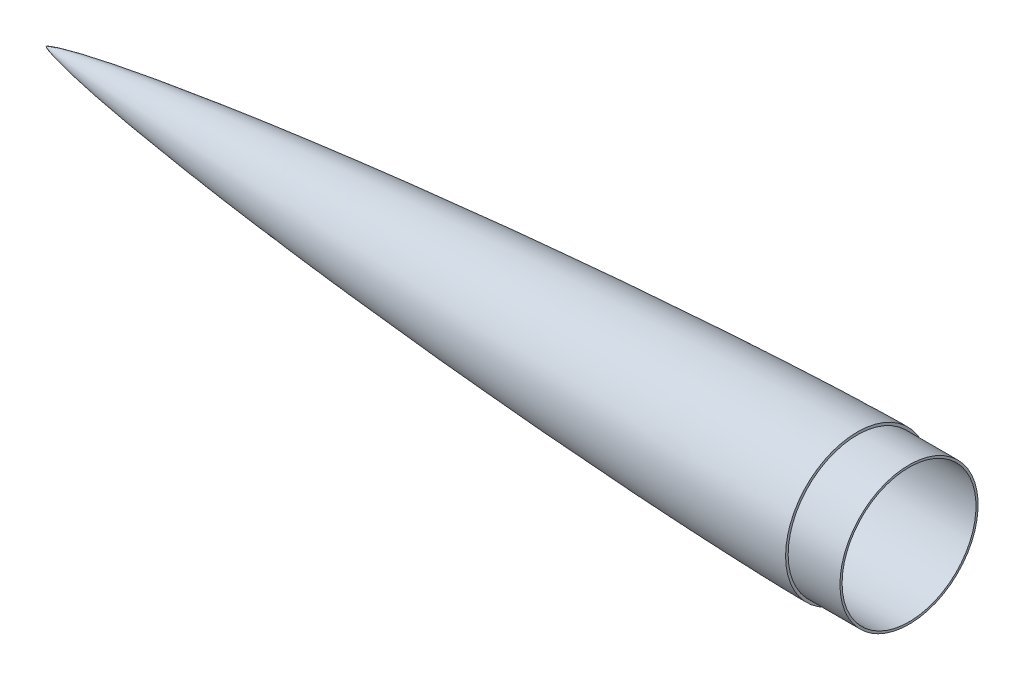
ISO-10303-21;
HEADER;
FILE_DESCRIPTION(('STEP AP214'),'2;1');
FILE_NAME('part.step','',(''),(''),'','','');
FILE_SCHEMA(('AUTOMOTIVE_DESIGN { 1 0 10303 214 1 1 1 1 }'));
ENDSEC;
DATA;
#1=APPLICATION_CONTEXT('core data for automotive mechanical design processes');
#2=APPLICATION_PROTOCOL_DEFINITION('international standard','automotive_design',2000,#1);
#3=PRODUCT_CONTEXT('',#1,'mechanical');
#4=PRODUCT('Part','Part','',(#3));
#5=PRODUCT_RELATED_PRODUCT_CATEGORY('part','',(#4));
#6=PRODUCT_DEFINITION_FORMATION('','',#4);
#7=PRODUCT_DEFINITION_CONTEXT('part definition',#1,'design');
#8=PRODUCT_DEFINITION('design','',#6,#7);
#9=PRODUCT_DEFINITION_SHAPE('','',#8);
#10=(LENGTH_UNIT() NAMED_UNIT(*) SI_UNIT(.MILLI.,.METRE.));
#11=(NAMED_UNIT(*) PLANE_ANGLE_UNIT() SI_UNIT($,.RADIAN.));
#12=(NAMED_UNIT(*) SI_UNIT($,.STERADIAN.) SOLID_ANGLE_UNIT());
#13=UNCERTAINTY_MEASURE_WITH_UNIT(LENGTH_MEASURE(1.E-05),#10,'distance_accuracy_value','');
#14=(GEOMETRIC_REPRESENTATION_CONTEXT(3) GLOBAL_UNCERTAINTY_ASSIGNED_CONTEXT((#13)) GLOBAL_UNIT_ASSIGNED_CONTEXT((#10,
#11,#12)) REPRESENTATION_CONTEXT('',''));
#15=CARTESIAN_POINT('',(0.,0.,0.));
#16=DIRECTION('',(0.,0.,1.));
#17=DIRECTION('',(1.,0.,0.));
#18=AXIS2_PLACEMENT_3D('',#15,#16,#17);
#19=CARTESIAN_POINT('',(596.9,52.74818,0.));
#20=CARTESIAN_POINT('',(594.981085772942,52.7439766182815,0.));
#21=CARTESIAN_POINT('',(591.143361642924,52.7119561177822,0.));
#22=CARTESIAN_POINT('',(583.468325071776,52.6115940478195,0.));
#23=CARTESIAN_POINT('',(571.206307330957,52.3702922496184,0.));
#24=CARTESIAN_POINT('',(556.277134536275,51.9856247831863,0.));
#25=CARTESIAN_POINT('',(534.095751609961,51.2822622218943,0.));
#26=CARTESIAN_POINT('',(506.5841207546,50.2205319325961,0.));
#27=CARTESIAN_POINT('',(474.496680759096,48.7563639094325,0.));
#28=CARTESIAN_POINT('',(437.838411885817,46.818732197122,0.));
#29=CARTESIAN_POINT('',(401.193599470544,44.6420572267023,0.));
#30=CARTESIAN_POINT('',(364.562894607915,42.2399567576188,0.));
#31=CARTESIAN_POINT('',(327.947239610889,39.618425854242,0.));
#32=CARTESIAN_POINT('',(291.348007401785,36.7768124514222,0.));
#33=CARTESIAN_POINT('',(254.767048184149,33.7085063186159,0.));
#34=CARTESIAN_POINT('',(218.207080059752,30.3992455850085,0.));
#35=CARTESIAN_POINT('',(181.67186265107,26.8260098654848,0.));
#36=CARTESIAN_POINT('',(145.167419267207,22.9502479118758,0.));
#37=CARTESIAN_POINT('',(108.703042074813,18.711081158448,0.));
#38=CARTESIAN_POINT('',(75.561592020845,14.4184193653755,0.));
#39=CARTESIAN_POINT('',(48.0380921073077,10.3790406790519,0.));
#40=CARTESIAN_POINT('',(27.782103231772,6.92717758336565,0.));
#41=CARTESIAN_POINT('',(15.6155281201881,4.51233854333897,0.));
#42=CARTESIAN_POINT('',(8.71933118048638,2.91617819387342,0.));
#43=CARTESIAN_POINT('',(5.02966537861984,1.92884340558088,0.));
#44=CARTESIAN_POINT('',(3.02858814726836,1.31676153051974,0.));
#45=CARTESIAN_POINT('',(1.91317692998907,0.93176035109636,0.));
#46=CARTESIAN_POINT('',(1.29300271208459,0.693253150144167,0.));
#47=CARTESIAN_POINT('',(0.932165851339865,0.541497874129996,0.));
#48=CARTESIAN_POINT('',(0.699728382330023,0.436250009913596,0.));
#49=CARTESIAN_POINT('',(0.539072772842008,0.359186242832004,0.));
#50=CARTESIAN_POINT('',(0.399119277455206,0.287038857933432,0.));
#51=CARTESIAN_POINT('',(0.279818282563663,0.220197585336474,0.));
#52=CARTESIAN_POINT('',(0.180428525159842,0.158737146182066,0.));
#53=CARTESIAN_POINT('',(0.110473241421188,0.110595859922417,0.));
#54=CARTESIAN_POINT('',(0.0582878402621543,0.0690247542532056,0.));
#55=CARTESIAN_POINT('',(0.023331290383149,0.0352525733814115,0.));
#56=CARTESIAN_POINT('',(0.00804574966633972,0.0163261743468633,0.));
#57=CARTESIAN_POINT('',(0.00237693213132801,0.00563433549737124,0.));
#58=CARTESIAN_POINT('',(0.,0.,0.));
#59=B_SPLINE_CURVE_WITH_KNOTS('',4,(#19,#20,#21,#22,#23,#24,#25,#26,#27,#28,#29,#30,#31,#32,#33,
#34,#35,#36,#37,#38,#39,#40,#41,#42,#43,#44,#45,#46,#47,#48,#49,#50,#51,#52,#53,#54,#55,#56,#57,
#58),.UNSPECIFIED.,.F.,.F.,(5,1,1,1,1,1,1,1,1,1,1,1,1,1,1,1,1,1,1,1,1,1,1,1,1,1,1,1,1,1,1,1,1,1,
1,1,5),(0.,0.0127915006460431,0.0255830012920861,0.0511660025841724,0.0817539552175705,
0.112341907850969,0.173517813554601,0.234693719179658,0.295869624144422,0.357045529383124,
0.418221434840136,0.479397340471153,0.54057324623338,0.601749151591606,0.662925056674679,
0.724100961894715,0.785276867533579,0.846452772012617,0.907628670550915,0.946859777235718,
0.970700652554181,0.983412262477229,0.990301731317356,0.994037247427691,0.996156512029755,
0.997358787258242,0.99816596334814,0.998465742833605,0.99876552231907,0.99905955597412,
0.99935358962917,0.999515192221878,0.999676794814585,0.999838397407293,0.999919198703646,
0.999959599351823,1.),.UNSPECIFIED.);
#60=CARTESIAN_POINT('',(0.,0.,0.));
#61=DIRECTION('',(-1.,0.,0.));
#62=AXIS1_PLACEMENT('',#60,#61);
#63=SURFACE_OF_REVOLUTION('',#59,#62);
#64=CARTESIAN_POINT('',(0.,0.,0.));
#65=VERTEX_POINT('',#64);
#66=VERTEX_LOOP('',#65);
#67=FACE_BOUND('',#66,.T.);
#68=CARTESIAN_POINT('',(596.9,0.,0.));
#69=DIRECTION('',(-1.,0.,0.));
#70=DIRECTION('',(0.,0.,1.));
#71=AXIS2_PLACEMENT_3D('',#68,#69,#70);
#72=CIRCLE('',#71,52.74818);
#73=CARTESIAN_POINT('',(596.9,0.,52.74818));
#74=VERTEX_POINT('',#73);
#75=EDGE_CURVE('E11',#74,#74,#72,.T.);
#76=ORIENTED_EDGE('',*,*,#75,.T.);
#77=EDGE_LOOP('',(#76));
#78=FACE_BOUND('',#77,.T.);
#79=ADVANCED_FACE('F42',(#67,#78),#63,.T.);
#80=CARTESIAN_POINT('',(596.9,0.,0.));
#81=DIRECTION('',(-1.,0.,0.));
#82=DIRECTION('',(0.,0.,1.));
#83=AXIS2_PLACEMENT_3D('',#80,#81,#82);
#84=PLANE('',#83);
#85=CARTESIAN_POINT('',(596.9,0.,0.));
#86=DIRECTION('',(-1.,0.,0.));
#87=DIRECTION('',(0.,0.,1.));
#88=AXIS2_PLACEMENT_3D('',#85,#86,#87);
#89=CIRCLE('',#88,50.8380953963041);
#90=CARTESIAN_POINT('',(596.9,0.,50.8380953963041));
#91=VERTEX_POINT('',#90);
#92=EDGE_CURVE('E51',#91,#91,#89,.F.);
#93=ORIENTED_EDGE('',*,*,#92,.F.);
#94=EDGE_LOOP('',(#93));
#95=FACE_BOUND('',#94,.T.);
#96=ORIENTED_EDGE('',*,*,#75,.F.);
#97=EDGE_LOOP('',(#96));
#98=FACE_BOUND('',#97,.T.);
#99=ADVANCED_FACE('F90',(#95,#98),#84,.F.);
#100=CARTESIAN_POINT('',(635.,0.,0.));
#101=DIRECTION('',(-1.,0.,0.));
#102=DIRECTION('',(0.,0.,1.));
#103=AXIS2_PLACEMENT_3D('',#100,#101,#102);
#104=CYLINDRICAL_SURFACE('',#103,50.8380953963041);
#105=CARTESIAN_POINT('',(635.,0.,0.));
#106=DIRECTION('',(1.,0.,0.));
#107=DIRECTION('',(0.,0.,-1.));
#108=AXIS2_PLACEMENT_3D('',#105,#106,#107);
#109=CIRCLE('',#108,50.8380953963041);
#110=CARTESIAN_POINT('',(635.,0.,50.8380953963041));
#111=VERTEX_POINT('',#110);
#112=EDGE_CURVE('E65',#111,#111,#109,.T.);
#113=CARTESIAN_POINT('',(635.,0.,50.8380953963041));
#114=CARTESIAN_POINT('',(634.603125,0.,50.8380953963041));
#115=CARTESIAN_POINT('',(634.20625,0.,50.8380953963041));
#116=CARTESIAN_POINT('',(633.4125,0.,50.8380953963041));
#117=CARTESIAN_POINT('',(633.015625,0.,50.8380953963041));
#118=CARTESIAN_POINT('',(632.221875,0.,50.8380953963041));
#119=CARTESIAN_POINT('',(631.825,0.,50.8380953963041));
#120=CARTESIAN_POINT('',(631.03125,0.,50.8380953963041));
#121=CARTESIAN_POINT('',(630.634375,0.,50.8380953963041));
#122=CARTESIAN_POINT('',(629.840625,0.,50.8380953963041));
#123=CARTESIAN_POINT('',(629.44375,0.,50.8380953963041));
#124=CARTESIAN_POINT('',(628.65,0.,50.8380953963041));
#125=CARTESIAN_POINT('',(628.253125,0.,50.8380953963041));
#126=CARTESIAN_POINT('',(627.459375,0.,50.8380953963041));
#127=CARTESIAN_POINT('',(627.0625,0.,50.8380953963041));
#128=CARTESIAN_POINT('',(626.26875,0.,50.8380953963041));
#129=CARTESIAN_POINT('',(625.871875,0.,50.8380953963041));
#130=CARTESIAN_POINT('',(625.078125,0.,50.8380953963041));
#131=CARTESIAN_POINT('',(624.68125,0.,50.8380953963041));
#132=CARTESIAN_POINT('',(623.8875,0.,50.8380953963041));
#133=CARTESIAN_POINT('',(623.490625,0.,50.8380953963041));
#134=CARTESIAN_POINT('',(622.696875,0.,50.8380953963041));
#135=CARTESIAN_POINT('',(622.3,0.,50.8380953963041));
#136=CARTESIAN_POINT('',(621.50625,0.,50.8380953963041));
#137=CARTESIAN_POINT('',(621.109375,0.,50.8380953963041));
#138=CARTESIAN_POINT('',(620.315625,0.,50.8380953963041));
#139=CARTESIAN_POINT('',(619.91875,0.,50.8380953963041));
#140=CARTESIAN_POINT('',(619.125,0.,50.8380953963041));
#141=CARTESIAN_POINT('',(618.728125,0.,50.8380953963041));
#142=CARTESIAN_POINT('',(617.934375,0.,50.8380953963041));
#143=CARTESIAN_POINT('',(617.5375,0.,50.8380953963041));
#144=CARTESIAN_POINT('',(616.74375,0.,50.8380953963041));
#145=CARTESIAN_POINT('',(616.346875,0.,50.8380953963041));
#146=CARTESIAN_POINT('',(615.553125,0.,50.8380953963041));
#147=CARTESIAN_POINT('',(615.15625,0.,50.8380953963041));
#148=CARTESIAN_POINT('',(614.3625,0.,50.8380953963041));
#149=CARTESIAN_POINT('',(613.965625,0.,50.8380953963041));
#150=CARTESIAN_POINT('',(613.171875,0.,50.8380953963041));
#151=CARTESIAN_POINT('',(612.775,0.,50.8380953963041));
#152=CARTESIAN_POINT('',(611.98125,0.,50.8380953963041));
#153=CARTESIAN_POINT('',(611.584375,0.,50.8380953963041));
#154=CARTESIAN_POINT('',(610.790625,0.,50.8380953963041));
#155=CARTESIAN_POINT('',(610.39375,0.,50.8380953963041));
#156=CARTESIAN_POINT('',(609.6,0.,50.8380953963041));
#157=CARTESIAN_POINT('',(609.203125,0.,50.8380953963041));
#158=CARTESIAN_POINT('',(608.409375,0.,50.8380953963041));
#159=CARTESIAN_POINT('',(608.0125,0.,50.8380953963041));
#160=CARTESIAN_POINT('',(607.21875,0.,50.8380953963041));
#161=CARTESIAN_POINT('',(606.821875,0.,50.8380953963041));
#162=CARTESIAN_POINT('',(606.028125,0.,50.8380953963041));
#163=CARTESIAN_POINT('',(605.63125,0.,50.8380953963041));
#164=CARTESIAN_POINT('',(604.8375,0.,50.8380953963041));
#165=CARTESIAN_POINT('',(604.440625,0.,50.8380953963041));
#166=CARTESIAN_POINT('',(603.646875,0.,50.8380953963041));
#167=CARTESIAN_POINT('',(603.25,0.,50.8380953963041));
#168=CARTESIAN_POINT('',(602.45625,0.,50.8380953963041));
#169=CARTESIAN_POINT('',(602.059375,0.,50.8380953963041));
#170=CARTESIAN_POINT('',(601.265625,0.,50.8380953963041));
#171=CARTESIAN_POINT('',(600.86875,0.,50.8380953963041));
#172=CARTESIAN_POINT('',(600.075,0.,50.8380953963041));
#173=CARTESIAN_POINT('',(599.678125,0.,50.8380953963041));
#174=CARTESIAN_POINT('',(598.884375,0.,50.8380953963041));
#175=CARTESIAN_POINT('',(598.4875,0.,50.8380953963041));
#176=CARTESIAN_POINT('',(597.69375,0.,50.8380953963041));
#177=CARTESIAN_POINT('',(597.296875,0.,50.8380953963041));
#178=CARTESIAN_POINT('',(596.9,0.,50.8380953963041));
#179=B_SPLINE_CURVE_WITH_KNOTS('',3,(#113,#114,#115,#116,#117,#118,#119,#120,#121,#122,#123,
#124,#125,#126,#127,#128,#129,#130,#131,#132,#133,#134,#135,#136,#137,#138,#139,#140,#141,#142,
#143,#144,#145,#146,#147,#148,#149,#150,#151,#152,#153,#154,#155,#156,#157,#158,#159,#160,#161,
#162,#163,#164,#165,#166,#167,#168,#169,#170,#171,#172,#173,#174,#175,#176,#177,#178),
.UNSPECIFIED.,.F.,.F.,(4,2,2,2,2,2,2,2,2,2,2,2,2,2,2,2,2,2,2,2,2,2,2,2,2,2,2,2,2,2,2,2,4),(0.,
1.19062499999989,2.38124999999989,3.57187499999989,4.76249999999989,5.95312499999989,
7.14374999999989,8.33437499999989,9.5249999999999,10.7156249999999,11.9062499999999,
13.0968749999999,14.2874999999999,15.4781249999999,16.6687499999999,17.8593749999999,
19.0499999999999,20.2406249999999,21.4312499999999,22.6218749999999,23.8124999999999,
25.0031249999999,26.1937499999999,27.3843749999999,28.5749999999999,29.7656249999999,
30.9562499999999,32.1468749999999,33.3374999999999,34.5281249999999,35.7187499999999,
36.9093749999998,38.0999999999998),.UNSPECIFIED.);
#180=EDGE_CURVE('BSEAM92',#111,#91,#179,.T.);
#181=ORIENTED_EDGE('',*,*,#112,.F.);
#182=ORIENTED_EDGE('',*,*,#92,.T.);
#183=ORIENTED_EDGE('',*,*,#180,.T.);
#184=ORIENTED_EDGE('',*,*,#180,.F.);
#185=EDGE_LOOP('',(#181,#183,#182,#184));
#186=FACE_BOUND('',#185,.T.);
#187=ADVANCED_FACE('F92',(#186),#104,.T.);
#188=CARTESIAN_POINT('',(558.8,0.,0.));
#189=DIRECTION('',(1.,0.,0.));
#190=DIRECTION('',(0.,0.,-1.));
#191=AXIS2_PLACEMENT_3D('',#188,#189,#190);
#192=PLANE('',#191);
#193=CARTESIAN_POINT('',(558.8,0.,0.));
#194=DIRECTION('',(1.,0.,0.));
#195=DIRECTION('',(0.,0.,-1.));
#196=AXIS2_PLACEMENT_3D('',#193,#194,#195);
#197=CIRCLE('',#196,49.2505953963041);
#198=CARTESIAN_POINT('',(558.8,0.,49.2505953963041));
#199=VERTEX_POINT('',#198);
#200=EDGE_CURVE('E74',#199,#199,#197,.T.);
#201=ORIENTED_EDGE('',*,*,#200,.T.);
#202=EDGE_LOOP('',(#201));
#203=FACE_BOUND('',#202,.T.);
#204=CARTESIAN_POINT('',(558.8,0.,0.));
#205=DIRECTION('',(-1.,0.,0.));
#206=DIRECTION('',(0.,0.,1.));
#207=AXIS2_PLACEMENT_3D('',#204,#205,#206);
#208=CIRCLE('',#207,50.1244954155033);
#209=CARTESIAN_POINT('',(558.8,0.,50.1244954155033));
#210=VERTEX_POINT('',#209);
#211=EDGE_CURVE('E46',#210,#210,#208,.F.);
#212=ORIENTED_EDGE('',*,*,#211,.F.);
#213=EDGE_LOOP('',(#212));
#214=FACE_BOUND('',#213,.T.);
#215=ADVANCED_FACE('F98',(#203,#214),#192,.F.);
#216=CARTESIAN_POINT('',(635.,0.,0.));
#217=DIRECTION('',(1.,0.,0.));
#218=DIRECTION('',(0.,0.,-1.));
#219=AXIS2_PLACEMENT_3D('',#216,#217,#218);
#220=PLANE('',#219);
#221=ORIENTED_EDGE('',*,*,#112,.T.);
#222=EDGE_LOOP('',(#221));
#223=FACE_BOUND('',#222,.T.);
#224=CARTESIAN_POINT('',(635.,0.,0.));
#225=DIRECTION('',(1.,0.,0.));
#226=DIRECTION('',(0.,0.,-1.));
#227=AXIS2_PLACEMENT_3D('',#224,#225,#226);
#228=CIRCLE('',#227,49.2505953963041);
#229=CARTESIAN_POINT('',(635.,0.,49.2505953963041));
#230=VERTEX_POINT('',#229);
#231=EDGE_CURVE('E69',#230,#230,#228,.T.);
#232=ORIENTED_EDGE('',*,*,#231,.F.);
#233=EDGE_LOOP('',(#232));
#234=FACE_BOUND('',#233,.T.);
#235=ADVANCED_FACE('F121',(#223,#234),#220,.T.);
#236=CARTESIAN_POINT('',(635.,0.,0.));
#237=DIRECTION('',(-1.,0.,0.));
#238=DIRECTION('',(0.,0.,1.));
#239=AXIS2_PLACEMENT_3D('',#236,#237,#238);
#240=CYLINDRICAL_SURFACE('',#239,49.2505953963041);
#241=CARTESIAN_POINT('',(635.,0.,49.2505953963041));
#242=CARTESIAN_POINT('',(634.20625,0.,49.2505953963041));
#243=CARTESIAN_POINT('',(633.4125,0.,49.2505953963041));
#244=CARTESIAN_POINT('',(631.825,0.,49.2505953963041));
#245=CARTESIAN_POINT('',(631.03125,0.,49.2505953963041));
#246=CARTESIAN_POINT('',(629.44375,0.,49.2505953963041));
#247=CARTESIAN_POINT('',(628.65,0.,49.2505953963041));
#248=CARTESIAN_POINT('',(627.0625,0.,49.2505953963041));
#249=CARTESIAN_POINT('',(626.26875,0.,49.2505953963041));
#250=CARTESIAN_POINT('',(624.68125,0.,49.2505953963041));
#251=CARTESIAN_POINT('',(623.8875,0.,49.2505953963041));
#252=CARTESIAN_POINT('',(622.3,0.,49.2505953963041));
#253=CARTESIAN_POINT('',(621.50625,0.,49.2505953963041));
#254=CARTESIAN_POINT('',(619.91875,0.,49.2505953963041));
#255=CARTESIAN_POINT('',(619.125,0.,49.2505953963041));
#256=CARTESIAN_POINT('',(617.5375,0.,49.2505953963041));
#257=CARTESIAN_POINT('',(616.74375,0.,49.2505953963041));
#258=CARTESIAN_POINT('',(615.15625,0.,49.2505953963041));
#259=CARTESIAN_POINT('',(614.3625,0.,49.2505953963041));
#260=CARTESIAN_POINT('',(612.775,0.,49.2505953963041));
#261=CARTESIAN_POINT('',(611.98125,0.,49.2505953963041));
#262=CARTESIAN_POINT('',(610.39375,0.,49.2505953963041));
#263=CARTESIAN_POINT('',(609.6,0.,49.2505953963041));
#264=CARTESIAN_POINT('',(608.0125,0.,49.2505953963041));
#265=CARTESIAN_POINT('',(607.21875,0.,49.2505953963041));
#266=CARTESIAN_POINT('',(605.63125,0.,49.2505953963041));
#267=CARTESIAN_POINT('',(604.8375,0.,49.2505953963041));
#268=CARTESIAN_POINT('',(603.25,0.,49.2505953963041));
#269=CARTESIAN_POINT('',(602.45625,0.,49.2505953963041));
#270=CARTESIAN_POINT('',(600.86875,0.,49.2505953963041));
#271=CARTESIAN_POINT('',(600.075,0.,49.2505953963041));
#272=CARTESIAN_POINT('',(598.4875,0.,49.2505953963041));
#273=CARTESIAN_POINT('',(597.69375,0.,49.2505953963041));
#274=CARTESIAN_POINT('',(596.10625,0.,49.2505953963041));
#275=CARTESIAN_POINT('',(595.3125,0.,49.2505953963041));
#276=CARTESIAN_POINT('',(593.725,0.,49.2505953963041));
#277=CARTESIAN_POINT('',(592.93125,0.,49.2505953963041));
#278=CARTESIAN_POINT('',(591.34375,0.,49.2505953963041));
#279=CARTESIAN_POINT('',(590.55,0.,49.2505953963041));
#280=CARTESIAN_POINT('',(588.9625,0.,49.2505953963041));
#281=CARTESIAN_POINT('',(588.16875,0.,49.2505953963041));
#282=CARTESIAN_POINT('',(586.58125,0.,49.2505953963041));
#283=CARTESIAN_POINT('',(585.7875,0.,49.2505953963041));
#284=CARTESIAN_POINT('',(584.2,0.,49.2505953963041));
#285=CARTESIAN_POINT('',(583.40625,0.,49.2505953963041));
#286=CARTESIAN_POINT('',(581.81875,0.,49.2505953963041));
#287=CARTESIAN_POINT('',(581.025,0.,49.2505953963041));
#288=CARTESIAN_POINT('',(579.4375,0.,49.2505953963041));
#289=CARTESIAN_POINT('',(578.64375,0.,49.2505953963041));
#290=CARTESIAN_POINT('',(577.05625,0.,49.2505953963041));
#291=CARTESIAN_POINT('',(576.2625,0.,49.2505953963041));
#292=CARTESIAN_POINT('',(574.675,0.,49.2505953963041));
#293=CARTESIAN_POINT('',(573.88125,0.,49.2505953963041));
#294=CARTESIAN_POINT('',(572.29375,0.,49.2505953963041));
#295=CARTESIAN_POINT('',(571.5,0.,49.2505953963041));
#296=CARTESIAN_POINT('',(569.9125,0.,49.2505953963041));
#297=CARTESIAN_POINT('',(569.11875,0.,49.2505953963041));
#298=CARTESIAN_POINT('',(567.53125,0.,49.2505953963041));
#299=CARTESIAN_POINT('',(566.7375,0.,49.2505953963041));
#300=CARTESIAN_POINT('',(565.15,0.,49.2505953963041));
#301=CARTESIAN_POINT('',(564.35625,0.,49.2505953963041));
#302=CARTESIAN_POINT('',(562.76875,0.,49.2505953963041));
#303=CARTESIAN_POINT('',(561.975,0.,49.2505953963041));
#304=CARTESIAN_POINT('',(560.3875,0.,49.2505953963041));
#305=CARTESIAN_POINT('',(559.59375,0.,49.2505953963041));
#306=CARTESIAN_POINT('',(558.8,0.,49.2505953963041));
#307=B_SPLINE_CURVE_WITH_KNOTS('',3,(#241,#242,#243,#244,#245,#246,#247,#248,#249,#250,#251,
#252,#253,#254,#255,#256,#257,#258,#259,#260,#261,#262,#263,#264,#265,#266,#267,#268,#269,#270,
#271,#272,#273,#274,#275,#276,#277,#278,#279,#280,#281,#282,#283,#284,#285,#286,#287,#288,#289,
#290,#291,#292,#293,#294,#295,#296,#297,#298,#299,#300,#301,#302,#303,#304,#305,#306),
.UNSPECIFIED.,.F.,.F.,(4,2,2,2,2,2,2,2,2,2,2,2,2,2,2,2,2,2,2,2,2,2,2,2,2,2,2,2,2,2,2,2,4),(0.,
2.38125,4.7625,7.14375,9.52500000000001,11.90625,14.2875,16.66875,19.05,21.43125,23.8125,
26.19375,28.575,30.95625,33.3375,35.71875,38.1,40.48125,42.8625,45.24375,47.625,50.00625,
52.3875,54.76875,57.15,59.53125,61.9125,64.29375,66.675,69.05625,71.4375,73.8187500000001,76.2),.UNSPECIFIED.);
#308=EDGE_CURVE('BSEAM60',#230,#199,#307,.T.);
#309=ORIENTED_EDGE('',*,*,#231,.T.);
#310=ORIENTED_EDGE('',*,*,#200,.F.);
#311=ORIENTED_EDGE('',*,*,#308,.T.);
#312=ORIENTED_EDGE('',*,*,#308,.F.);
#313=EDGE_LOOP('',(#309,#311,#310,#312));
#314=FACE_BOUND('',#313,.T.);
#315=ADVANCED_FACE('F60',(#314),#240,.F.);
#316=CARTESIAN_POINT('',(596.9,52.74818,0.));
#317=CARTESIAN_POINT('',(594.981085772942,52.7439766182815,0.));
#318=CARTESIAN_POINT('',(591.143361642924,52.7119561177822,0.));
#319=CARTESIAN_POINT('',(583.468325071776,52.6115940478195,0.));
#320=CARTESIAN_POINT('',(571.206307330957,52.3702922496184,0.));
#321=CARTESIAN_POINT('',(556.277134536275,51.9856247831863,0.));
#322=CARTESIAN_POINT('',(534.095751609961,51.2822622218943,0.));
#323=CARTESIAN_POINT('',(506.5841207546,50.2205319325961,0.));
#324=CARTESIAN_POINT('',(474.496680759096,48.7563639094325,0.));
#325=CARTESIAN_POINT('',(437.838411885817,46.818732197122,0.));
#326=CARTESIAN_POINT('',(401.193599470544,44.6420572267023,0.));
#327=CARTESIAN_POINT('',(364.562894607915,42.2399567576188,0.));
#328=CARTESIAN_POINT('',(327.947239610889,39.618425854242,0.));
#329=CARTESIAN_POINT('',(291.348007401785,36.7768124514222,0.));
#330=CARTESIAN_POINT('',(254.767048184149,33.7085063186159,0.));
#331=CARTESIAN_POINT('',(218.207080059752,30.3992455850085,0.));
#332=CARTESIAN_POINT('',(181.67186265107,26.8260098654848,0.));
#333=CARTESIAN_POINT('',(145.167419267207,22.9502479118758,0.));
#334=CARTESIAN_POINT('',(108.703042074813,18.711081158448,0.));
#335=CARTESIAN_POINT('',(75.561592020845,14.4184193653755,0.));
#336=CARTESIAN_POINT('',(48.0380921073077,10.3790406790519,0.));
#337=CARTESIAN_POINT('',(27.782103231772,6.92717758336565,0.));
#338=CARTESIAN_POINT('',(15.6155281201881,4.51233854333897,0.));
#339=CARTESIAN_POINT('',(9.10026394578531,3.00434704709772,0.));
#340=CARTESIAN_POINT('',(6.09264242860423,2.21175303915275,0.));
#341=CARTESIAN_POINT('',(4.93563552969569,1.88238723916885,0.));
#342=CARTESIAN_POINT('',(4.77280588160991,1.8355007837493,0.));
#343=B_SPLINE_CURVE_WITH_KNOTS('',4,(#316,#317,#318,#319,#320,#321,#322,#323,#324,#325,#326,
#327,#328,#329,#330,#331,#332,#333,#334,#335,#336,#337,#338,#339,#340,#341,#342),.UNSPECIFIED.,
.F.,.F.,(5,1,1,1,1,1,1,1,1,1,1,1,1,1,1,1,1,1,1,1,1,1,1,5),(0.,0.0127915006460431,
0.0255830012920861,0.0511660025841724,0.0817539552175705,0.112341907850969,0.173517813554601,
0.234693719179658,0.295869624144422,0.357045529383124,0.418221434840136,0.479397340471153,
0.54057324623338,0.601749151591606,0.662925056674679,0.724100961894715,0.785276867533579,
0.846452772012617,0.907628670550915,0.946859777235718,0.970700652554181,0.983412262477229,
0.990301731317356,0.991431253959526),.UNSPECIFIED.);
#344=CARTESIAN_POINT('',(0.,0.,0.));
#345=DIRECTION('',(-1.,0.,0.));
#346=AXIS1_PLACEMENT('',#344,#345);
#347=SURFACE_OF_REVOLUTION('',#343,#346);
#348=OFFSET_SURFACE('',#347,-1.91008,.F.);
#349=CARTESIAN_POINT('',(5.30133447994278,0.,0.));
#350=VERTEX_POINT('',#349);
#351=VERTEX_LOOP('',#350);
#352=FACE_BOUND('',#351,.T.);
#353=ORIENTED_EDGE('',*,*,#211,.T.);
#354=EDGE_LOOP('',(#353));
#355=FACE_BOUND('',#354,.T.);
#356=ADVANCED_FACE('F57',(#352,#355),#348,.F.);
#357=CLOSED_SHELL('',(#79,#99,#187,#215,#235,#315,#356));
#358=MANIFOLD_SOLID_BREP('B2',#357);
#359=ADVANCED_BREP_SHAPE_REPRESENTATION('',(#18,#358),#14);
#360=SHAPE_DEFINITION_REPRESENTATION(#9,#359);
ENDSEC;
END-ISO-10303-21;
